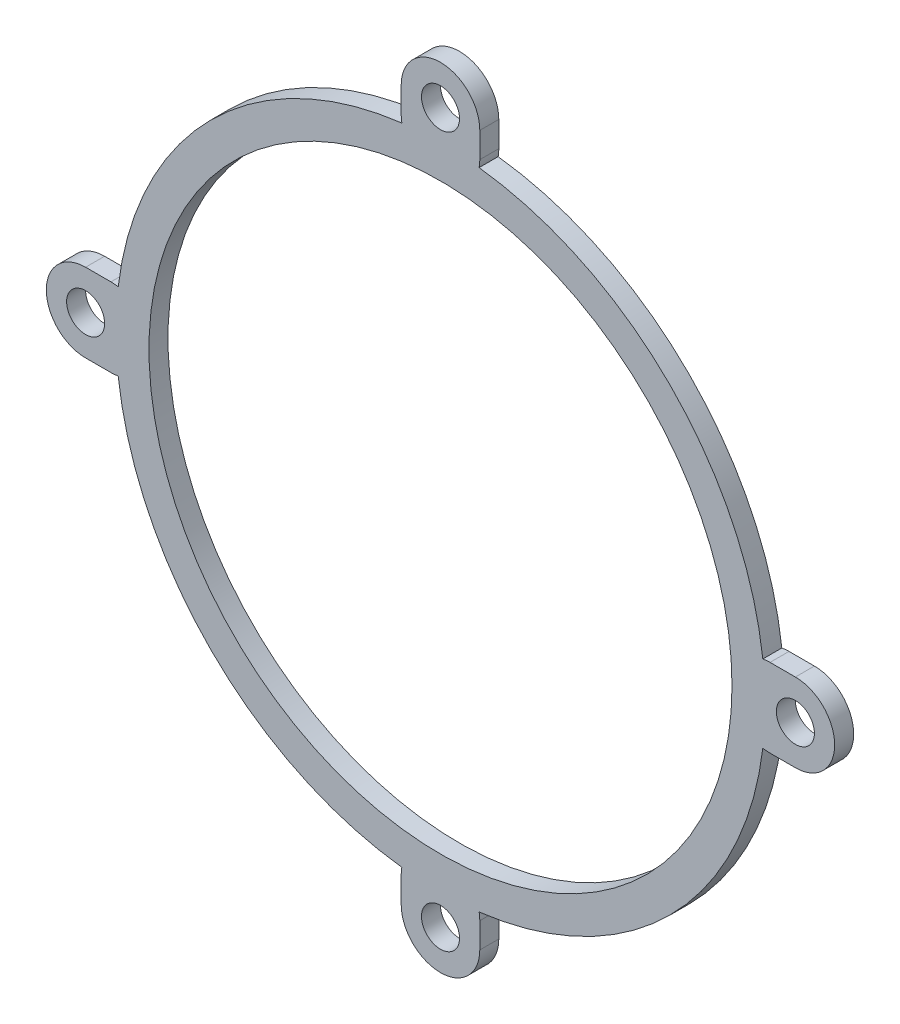
ISO-10303-21;
HEADER;
FILE_DESCRIPTION(('STEP AP214'),'2;1');
FILE_NAME('part.step','',(''),(''),'','','');
FILE_SCHEMA(('AUTOMOTIVE_DESIGN { 1 0 10303 214 1 1 1 1 }'));
ENDSEC;
DATA;
#1=APPLICATION_CONTEXT('core data for automotive mechanical design processes');
#2=APPLICATION_PROTOCOL_DEFINITION('international standard','automotive_design',2000,#1);
#3=PRODUCT_CONTEXT('',#1,'mechanical');
#4=PRODUCT('Part','Part','',(#3));
#5=PRODUCT_RELATED_PRODUCT_CATEGORY('part','',(#4));
#6=PRODUCT_DEFINITION_FORMATION('','',#4);
#7=PRODUCT_DEFINITION_CONTEXT('part definition',#1,'design');
#8=PRODUCT_DEFINITION('design','',#6,#7);
#9=PRODUCT_DEFINITION_SHAPE('','',#8);
#10=(LENGTH_UNIT() NAMED_UNIT(*) SI_UNIT(.MILLI.,.METRE.));
#11=(NAMED_UNIT(*) PLANE_ANGLE_UNIT() SI_UNIT($,.RADIAN.));
#12=(NAMED_UNIT(*) SI_UNIT($,.STERADIAN.) SOLID_ANGLE_UNIT());
#13=UNCERTAINTY_MEASURE_WITH_UNIT(LENGTH_MEASURE(1.E-05),#10,'distance_accuracy_value','');
#14=(GEOMETRIC_REPRESENTATION_CONTEXT(3) GLOBAL_UNCERTAINTY_ASSIGNED_CONTEXT((#13)) GLOBAL_UNIT_ASSIGNED_CONTEXT((#10,
#11,#12)) REPRESENTATION_CONTEXT('',''));
#15=CARTESIAN_POINT('',(0.,0.,0.));
#16=DIRECTION('',(0.,0.,1.));
#17=DIRECTION('',(1.,0.,0.));
#18=AXIS2_PLACEMENT_3D('',#15,#16,#17);
#19=CARTESIAN_POINT('',(0.,-26.,1.5));
#20=DIRECTION('',(0.,0.,1.));
#21=DIRECTION('',(1.,0.,0.));
#22=AXIS2_PLACEMENT_3D('',#19,#20,#21);
#23=PLANE('',#22);
#24=CARTESIAN_POINT('',(28.,0.,1.5));
#25=DIRECTION('',(0.,0.,1.));
#26=DIRECTION('',(1.,0.,0.));
#27=AXIS2_PLACEMENT_3D('',#24,#25,#26);
#28=CIRCLE('',#27,1.5);
#29=CARTESIAN_POINT('',(29.5,0.,1.5));
#30=VERTEX_POINT('',#29);
#31=EDGE_CURVE('E528',#30,#30,#28,.T.);
#32=ORIENTED_EDGE('',*,*,#31,.F.);
#33=EDGE_LOOP('',(#32));
#34=FACE_BOUND('',#33,.T.);
#35=CARTESIAN_POINT('',(-28.,0.,1.5));
#36=DIRECTION('',(0.,0.,1.));
#37=DIRECTION('',(1.,0.,0.));
#38=AXIS2_PLACEMENT_3D('',#35,#36,#37);
#39=CIRCLE('',#38,1.5);
#40=CARTESIAN_POINT('',(-26.5,0.,1.5));
#41=VERTEX_POINT('',#40);
#42=EDGE_CURVE('E544',#41,#41,#39,.T.);
#43=ORIENTED_EDGE('',*,*,#42,.F.);
#44=EDGE_LOOP('',(#43));
#45=FACE_BOUND('',#44,.T.);
#46=CARTESIAN_POINT('',(0.,-26.,1.5));
#47=DIRECTION('',(0.,0.,1.));
#48=DIRECTION('',(1.,0.,0.));
#49=AXIS2_PLACEMENT_3D('',#46,#47,#48);
#50=CIRCLE('',#49,3.1);
#51=CARTESIAN_POINT('',(3.1,-26.,1.5));
#52=VERTEX_POINT('',#51);
#53=CARTESIAN_POINT('',(3.04696472646622,-25.4290306876279,1.5));
#54=VERTEX_POINT('',#53);
#55=EDGE_CURVE('E308',#52,#54,#50,.T.);
#56=ORIENTED_EDGE('',*,*,#55,.T.);
#57=CARTESIAN_POINT('',(0.,0.,1.5));
#58=DIRECTION('',(0.,0.,1.));
#59=DIRECTION('',(1.,0.,0.));
#60=AXIS2_PLACEMENT_3D('',#57,#58,#59);
#61=CIRCLE('',#60,25.6109272724876);
#62=CARTESIAN_POINT('',(25.4290306876279,-3.04696472646621,1.5));
#63=VERTEX_POINT('',#62);
#64=EDGE_CURVE('E148',#54,#63,#61,.T.);
#65=ORIENTED_EDGE('',*,*,#64,.T.);
#66=CARTESIAN_POINT('',(26.,0.,1.5));
#67=DIRECTION('',(0.,0.,1.));
#68=DIRECTION('',(1.,0.,0.));
#69=AXIS2_PLACEMENT_3D('',#66,#67,#68);
#70=CIRCLE('',#69,3.1);
#71=CARTESIAN_POINT('',(26.,-3.1,1.5));
#72=VERTEX_POINT('',#71);
#73=EDGE_CURVE('E393',#63,#72,#70,.T.);
#74=ORIENTED_EDGE('',*,*,#73,.T.);
#75=DIRECTION('',(1.,0.,0.));
#76=VECTOR('',#75,1.);
#77=CARTESIAN_POINT('',(26.,-3.1,1.5));
#78=LINE('',#77,#76);
#79=CARTESIAN_POINT('',(28.,-3.1,1.5));
#80=VERTEX_POINT('',#79);
#81=EDGE_CURVE('E413',#72,#80,#78,.T.);
#82=ORIENTED_EDGE('',*,*,#81,.T.);
#83=CARTESIAN_POINT('',(28.,0.,1.5));
#84=DIRECTION('',(0.,0.,1.));
#85=DIRECTION('',(1.,0.,0.));
#86=AXIS2_PLACEMENT_3D('',#83,#84,#85);
#87=CIRCLE('',#86,3.1);
#88=CARTESIAN_POINT('',(28.,3.1,1.5));
#89=VERTEX_POINT('',#88);
#90=EDGE_CURVE('E409',#80,#89,#87,.T.);
#91=ORIENTED_EDGE('',*,*,#90,.T.);
#92=DIRECTION('',(-1.,0.,0.));
#93=VECTOR('',#92,1.);
#94=CARTESIAN_POINT('',(28.,3.1,1.5));
#95=LINE('',#94,#93);
#96=CARTESIAN_POINT('',(26.,3.1,1.5));
#97=VERTEX_POINT('',#96);
#98=EDGE_CURVE('E412',#89,#97,#95,.T.);
#99=ORIENTED_EDGE('',*,*,#98,.T.);
#100=CARTESIAN_POINT('',(26.,0.,1.5));
#101=DIRECTION('',(0.,0.,1.));
#102=DIRECTION('',(1.,0.,0.));
#103=AXIS2_PLACEMENT_3D('',#100,#101,#102);
#104=CIRCLE('',#103,3.1);
#105=CARTESIAN_POINT('',(25.4290306876279,3.04696472646622,1.5));
#106=VERTEX_POINT('',#105);
#107=EDGE_CURVE('E417',#97,#106,#104,.T.);
#108=ORIENTED_EDGE('',*,*,#107,.T.);
#109=CARTESIAN_POINT('',(0.,0.,1.5));
#110=DIRECTION('',(0.,0.,1.));
#111=DIRECTION('',(1.,0.,0.));
#112=AXIS2_PLACEMENT_3D('',#109,#110,#111);
#113=CIRCLE('',#112,25.6109272724876);
#114=CARTESIAN_POINT('',(3.04696472646621,25.4290306876279,1.5));
#115=VERTEX_POINT('',#114);
#116=EDGE_CURVE('E424',#106,#115,#113,.T.);
#117=ORIENTED_EDGE('',*,*,#116,.T.);
#118=CARTESIAN_POINT('',(0.,26.,1.5));
#119=DIRECTION('',(0.,0.,1.));
#120=DIRECTION('',(1.,0.,0.));
#121=AXIS2_PLACEMENT_3D('',#118,#119,#120);
#122=CIRCLE('',#121,3.1);
#123=CARTESIAN_POINT('',(3.09999999999999,26.,1.5));
#124=VERTEX_POINT('',#123);
#125=EDGE_CURVE('E427',#115,#124,#122,.T.);
#126=ORIENTED_EDGE('',*,*,#125,.T.);
#127=DIRECTION('',(0.,1.,0.));
#128=VECTOR('',#127,1.);
#129=CARTESIAN_POINT('',(3.09999999999999,26.,1.5));
#130=LINE('',#129,#128);
#131=CARTESIAN_POINT('',(3.09999999999999,28.,1.5));
#132=VERTEX_POINT('',#131);
#133=EDGE_CURVE('E430',#124,#132,#130,.T.);
#134=ORIENTED_EDGE('',*,*,#133,.T.);
#135=CARTESIAN_POINT('',(0.,28.,1.5));
#136=DIRECTION('',(0.,0.,1.));
#137=DIRECTION('',(1.,0.,0.));
#138=AXIS2_PLACEMENT_3D('',#135,#136,#137);
#139=CIRCLE('',#138,3.1);
#140=CARTESIAN_POINT('',(-3.10000000000001,28.,1.5));
#141=VERTEX_POINT('',#140);
#142=EDGE_CURVE('E433',#132,#141,#139,.T.);
#143=ORIENTED_EDGE('',*,*,#142,.T.);
#144=DIRECTION('',(0.,-1.,0.));
#145=VECTOR('',#144,1.);
#146=CARTESIAN_POINT('',(-3.10000000000002,28.,1.5));
#147=LINE('',#146,#145);
#148=CARTESIAN_POINT('',(-3.10000000000002,26.,1.5));
#149=VERTEX_POINT('',#148);
#150=EDGE_CURVE('E436',#141,#149,#147,.T.);
#151=ORIENTED_EDGE('',*,*,#150,.T.);
#152=CARTESIAN_POINT('',(0.,26.,1.5));
#153=DIRECTION('',(0.,0.,1.));
#154=DIRECTION('',(1.,0.,0.));
#155=AXIS2_PLACEMENT_3D('',#152,#153,#154);
#156=CIRCLE('',#155,3.1);
#157=CARTESIAN_POINT('',(-3.04696472646623,25.4290306876279,1.5));
#158=VERTEX_POINT('',#157);
#159=EDGE_CURVE('E439',#149,#158,#156,.T.);
#160=ORIENTED_EDGE('',*,*,#159,.T.);
#161=CARTESIAN_POINT('',(0.,0.,1.5));
#162=DIRECTION('',(0.,0.,1.));
#163=DIRECTION('',(1.,0.,0.));
#164=AXIS2_PLACEMENT_3D('',#161,#162,#163);
#165=CIRCLE('',#164,25.6109272724876);
#166=CARTESIAN_POINT('',(-25.4290306876279,3.04696472646622,1.5));
#167=VERTEX_POINT('',#166);
#168=EDGE_CURVE('E442',#158,#167,#165,.T.);
#169=ORIENTED_EDGE('',*,*,#168,.T.);
#170=CARTESIAN_POINT('',(-26.,0.,1.5));
#171=DIRECTION('',(0.,0.,1.));
#172=DIRECTION('',(1.,0.,0.));
#173=AXIS2_PLACEMENT_3D('',#170,#171,#172);
#174=CIRCLE('',#173,3.1);
#175=CARTESIAN_POINT('',(-26.,3.1,1.5));
#176=VERTEX_POINT('',#175);
#177=EDGE_CURVE('E445',#167,#176,#174,.T.);
#178=ORIENTED_EDGE('',*,*,#177,.T.);
#179=DIRECTION('',(-1.,0.,0.));
#180=VECTOR('',#179,1.);
#181=CARTESIAN_POINT('',(-26.,3.1,1.5));
#182=LINE('',#181,#180);
#183=CARTESIAN_POINT('',(-28.,3.1,1.5));
#184=VERTEX_POINT('',#183);
#185=EDGE_CURVE('E448',#176,#184,#182,.T.);
#186=ORIENTED_EDGE('',*,*,#185,.T.);
#187=CARTESIAN_POINT('',(-28.,0.,1.5));
#188=DIRECTION('',(0.,0.,1.));
#189=DIRECTION('',(1.,0.,0.));
#190=AXIS2_PLACEMENT_3D('',#187,#188,#189);
#191=CIRCLE('',#190,3.1);
#192=CARTESIAN_POINT('',(-28.,-3.1,1.5));
#193=VERTEX_POINT('',#192);
#194=EDGE_CURVE('E451',#184,#193,#191,.T.);
#195=ORIENTED_EDGE('',*,*,#194,.T.);
#196=DIRECTION('',(1.,0.,0.));
#197=VECTOR('',#196,1.);
#198=CARTESIAN_POINT('',(-28.,-3.1,1.5));
#199=LINE('',#198,#197);
#200=CARTESIAN_POINT('',(-26.,-3.1,1.5));
#201=VERTEX_POINT('',#200);
#202=EDGE_CURVE('E454',#193,#201,#199,.T.);
#203=ORIENTED_EDGE('',*,*,#202,.T.);
#204=CARTESIAN_POINT('',(-26.,0.,1.5));
#205=DIRECTION('',(0.,0.,1.));
#206=DIRECTION('',(1.,0.,0.));
#207=AXIS2_PLACEMENT_3D('',#204,#205,#206);
#208=CIRCLE('',#207,3.1);
#209=CARTESIAN_POINT('',(-25.4290306876279,-3.04696472646621,1.5));
#210=VERTEX_POINT('',#209);
#211=EDGE_CURVE('E457',#201,#210,#208,.T.);
#212=ORIENTED_EDGE('',*,*,#211,.T.);
#213=CARTESIAN_POINT('',(0.,0.,1.5));
#214=DIRECTION('',(0.,0.,1.));
#215=DIRECTION('',(1.,0.,0.));
#216=AXIS2_PLACEMENT_3D('',#213,#214,#215);
#217=CIRCLE('',#216,25.6109272724876);
#218=CARTESIAN_POINT('',(-3.04696472646621,-25.4290306876279,1.5));
#219=VERTEX_POINT('',#218);
#220=EDGE_CURVE('E460',#210,#219,#217,.T.);
#221=ORIENTED_EDGE('',*,*,#220,.T.);
#222=CARTESIAN_POINT('',(0.,-26.,1.5));
#223=DIRECTION('',(0.,0.,1.));
#224=DIRECTION('',(1.,0.,0.));
#225=AXIS2_PLACEMENT_3D('',#222,#223,#224);
#226=CIRCLE('',#225,3.1);
#227=CARTESIAN_POINT('',(-3.1,-26.,1.5));
#228=VERTEX_POINT('',#227);
#229=EDGE_CURVE('E215',#219,#228,#226,.T.);
#230=ORIENTED_EDGE('',*,*,#229,.T.);
#231=DIRECTION('',(0.,-1.,0.));
#232=VECTOR('',#231,1.);
#233=CARTESIAN_POINT('',(-3.1,-26.,1.5));
#234=LINE('',#233,#232);
#235=CARTESIAN_POINT('',(-3.1,-28.,1.5));
#236=VERTEX_POINT('',#235);
#237=EDGE_CURVE('E209',#228,#236,#234,.T.);
#238=ORIENTED_EDGE('',*,*,#237,.T.);
#239=CARTESIAN_POINT('',(0.,-28.,1.5));
#240=DIRECTION('',(0.,0.,1.));
#241=DIRECTION('',(1.,0.,0.));
#242=AXIS2_PLACEMENT_3D('',#239,#240,#241);
#243=CIRCLE('',#242,3.1);
#244=CARTESIAN_POINT('',(3.1,-28.,1.5));
#245=VERTEX_POINT('',#244);
#246=EDGE_CURVE('E213',#236,#245,#243,.T.);
#247=ORIENTED_EDGE('',*,*,#246,.T.);
#248=DIRECTION('',(0.,1.,0.));
#249=VECTOR('',#248,1.);
#250=CARTESIAN_POINT('',(3.1,-28.,1.5));
#251=LINE('',#250,#249);
#252=EDGE_CURVE('E57',#245,#52,#251,.T.);
#253=ORIENTED_EDGE('',*,*,#252,.T.);
#254=EDGE_LOOP('',(#56,#65,#74,#82,#91,#99,#108,#117,#126,#134,#143,#151,#160,#169,#178,#186,
#195,#203,#212,#221,#230,#238,#247,#253));
#255=FACE_BOUND('',#254,.T.);
#256=CARTESIAN_POINT('',(0.,0.,1.5));
#257=DIRECTION('',(0.,0.,1.));
#258=DIRECTION('',(1.,0.,0.));
#259=AXIS2_PLACEMENT_3D('',#256,#257,#258);
#260=CIRCLE('',#259,23.);
#261=CARTESIAN_POINT('',(23.,0.,1.5));
#262=VERTEX_POINT('',#261);
#263=EDGE_CURVE('E242',#262,#262,#260,.T.);
#264=ORIENTED_EDGE('',*,*,#263,.F.);
#265=EDGE_LOOP('',(#264));
#266=FACE_BOUND('',#265,.T.);
#267=CARTESIAN_POINT('',(0.,28.,1.5));
#268=DIRECTION('',(0.,0.,1.));
#269=DIRECTION('',(1.,0.,0.));
#270=AXIS2_PLACEMENT_3D('',#267,#268,#269);
#271=CIRCLE('',#270,1.5);
#272=CARTESIAN_POINT('',(1.49999999999999,28.,1.5));
#273=VERTEX_POINT('',#272);
#274=EDGE_CURVE('E536',#273,#273,#271,.T.);
#275=ORIENTED_EDGE('',*,*,#274,.F.);
#276=EDGE_LOOP('',(#275));
#277=FACE_BOUND('',#276,.T.);
#278=CARTESIAN_POINT('',(0.,-28.,1.5));
#279=DIRECTION('',(0.,0.,1.));
#280=DIRECTION('',(1.,0.,0.));
#281=AXIS2_PLACEMENT_3D('',#278,#279,#280);
#282=CIRCLE('',#281,1.5);
#283=CARTESIAN_POINT('',(1.5,-28.,1.5));
#284=VERTEX_POINT('',#283);
#285=EDGE_CURVE('E517',#284,#284,#282,.T.);
#286=ORIENTED_EDGE('',*,*,#285,.F.);
#287=EDGE_LOOP('',(#286));
#288=FACE_BOUND('',#287,.T.);
#289=ADVANCED_FACE('F39',(#34,#45,#255,#266,#277,#288),#23,.T.);
#290=CARTESIAN_POINT('',(0.,-26.,0.));
#291=DIRECTION('',(0.,0.,1.));
#292=DIRECTION('',(1.,0.,0.));
#293=AXIS2_PLACEMENT_3D('',#290,#291,#292);
#294=PLANE('',#293);
#295=CARTESIAN_POINT('',(0.,-26.,0.));
#296=DIRECTION('',(0.,0.,1.));
#297=DIRECTION('',(1.,0.,0.));
#298=AXIS2_PLACEMENT_3D('',#295,#296,#297);
#299=CIRCLE('',#298,3.1);
#300=CARTESIAN_POINT('',(3.1,-26.,0.));
#301=VERTEX_POINT('',#300);
#302=CARTESIAN_POINT('',(3.04696472646622,-25.4290306876279,0.));
#303=VERTEX_POINT('',#302);
#304=EDGE_CURVE('E237',#301,#303,#299,.T.);
#305=ORIENTED_EDGE('',*,*,#304,.F.);
#306=DIRECTION('',(0.,1.,0.));
#307=VECTOR('',#306,1.);
#308=CARTESIAN_POINT('',(3.1,-28.,0.));
#309=LINE('',#308,#307);
#310=CARTESIAN_POINT('',(3.1,-28.,0.));
#311=VERTEX_POINT('',#310);
#312=EDGE_CURVE('E140',#311,#301,#309,.T.);
#313=ORIENTED_EDGE('',*,*,#312,.F.);
#314=CARTESIAN_POINT('',(0.,-28.,0.));
#315=DIRECTION('',(0.,0.,1.));
#316=DIRECTION('',(1.,0.,0.));
#317=AXIS2_PLACEMENT_3D('',#314,#315,#316);
#318=CIRCLE('',#317,3.1);
#319=CARTESIAN_POINT('',(-3.1,-28.,0.));
#320=VERTEX_POINT('',#319);
#321=EDGE_CURVE('E134',#320,#311,#318,.T.);
#322=ORIENTED_EDGE('',*,*,#321,.F.);
#323=DIRECTION('',(0.,-1.,0.));
#324=VECTOR('',#323,1.);
#325=CARTESIAN_POINT('',(-3.1,-26.,0.));
#326=LINE('',#325,#324);
#327=CARTESIAN_POINT('',(-3.1,-26.,0.));
#328=VERTEX_POINT('',#327);
#329=EDGE_CURVE('E224',#328,#320,#326,.T.);
#330=ORIENTED_EDGE('',*,*,#329,.F.);
#331=CARTESIAN_POINT('',(0.,-26.,0.));
#332=DIRECTION('',(0.,0.,1.));
#333=DIRECTION('',(1.,0.,0.));
#334=AXIS2_PLACEMENT_3D('',#331,#332,#333);
#335=CIRCLE('',#334,3.1);
#336=CARTESIAN_POINT('',(-3.04696472646621,-25.4290306876279,0.));
#337=VERTEX_POINT('',#336);
#338=EDGE_CURVE('E299',#337,#328,#335,.T.);
#339=ORIENTED_EDGE('',*,*,#338,.F.);
#340=CARTESIAN_POINT('',(0.,0.,0.));
#341=DIRECTION('',(0.,0.,1.));
#342=DIRECTION('',(1.,0.,0.));
#343=AXIS2_PLACEMENT_3D('',#340,#341,#342);
#344=CIRCLE('',#343,25.6109272724876);
#345=CARTESIAN_POINT('',(-25.4290306876279,-3.04696472646621,0.));
#346=VERTEX_POINT('',#345);
#347=EDGE_CURVE('E296',#346,#337,#344,.T.);
#348=ORIENTED_EDGE('',*,*,#347,.F.);
#349=CARTESIAN_POINT('',(-26.,0.,0.));
#350=DIRECTION('',(0.,0.,1.));
#351=DIRECTION('',(1.,0.,0.));
#352=AXIS2_PLACEMENT_3D('',#349,#350,#351);
#353=CIRCLE('',#352,3.1);
#354=CARTESIAN_POINT('',(-26.,-3.1,0.));
#355=VERTEX_POINT('',#354);
#356=EDGE_CURVE('E293',#355,#346,#353,.T.);
#357=ORIENTED_EDGE('',*,*,#356,.F.);
#358=DIRECTION('',(1.,0.,0.));
#359=VECTOR('',#358,1.);
#360=CARTESIAN_POINT('',(-28.,-3.1,0.));
#361=LINE('',#360,#359);
#362=CARTESIAN_POINT('',(-28.,-3.1,0.));
#363=VERTEX_POINT('',#362);
#364=EDGE_CURVE('E290',#363,#355,#361,.T.);
#365=ORIENTED_EDGE('',*,*,#364,.F.);
#366=CARTESIAN_POINT('',(-28.,0.,0.));
#367=DIRECTION('',(0.,0.,1.));
#368=DIRECTION('',(1.,0.,0.));
#369=AXIS2_PLACEMENT_3D('',#366,#367,#368);
#370=CIRCLE('',#369,3.1);
#371=CARTESIAN_POINT('',(-28.,3.1,0.));
#372=VERTEX_POINT('',#371);
#373=EDGE_CURVE('E287',#372,#363,#370,.T.);
#374=ORIENTED_EDGE('',*,*,#373,.F.);
#375=DIRECTION('',(-1.,0.,0.));
#376=VECTOR('',#375,1.);
#377=CARTESIAN_POINT('',(-26.,3.1,0.));
#378=LINE('',#377,#376);
#379=CARTESIAN_POINT('',(-26.,3.1,0.));
#380=VERTEX_POINT('',#379);
#381=EDGE_CURVE('E284',#380,#372,#378,.T.);
#382=ORIENTED_EDGE('',*,*,#381,.F.);
#383=CARTESIAN_POINT('',(-26.,0.,0.));
#384=DIRECTION('',(0.,0.,1.));
#385=DIRECTION('',(1.,0.,0.));
#386=AXIS2_PLACEMENT_3D('',#383,#384,#385);
#387=CIRCLE('',#386,3.1);
#388=CARTESIAN_POINT('',(-25.4290306876279,3.04696472646622,0.));
#389=VERTEX_POINT('',#388);
#390=EDGE_CURVE('E281',#389,#380,#387,.T.);
#391=ORIENTED_EDGE('',*,*,#390,.F.);
#392=CARTESIAN_POINT('',(0.,0.,0.));
#393=DIRECTION('',(0.,0.,1.));
#394=DIRECTION('',(1.,0.,0.));
#395=AXIS2_PLACEMENT_3D('',#392,#393,#394);
#396=CIRCLE('',#395,25.6109272724876);
#397=CARTESIAN_POINT('',(-3.04696472646623,25.4290306876279,0.));
#398=VERTEX_POINT('',#397);
#399=EDGE_CURVE('E278',#398,#389,#396,.T.);
#400=ORIENTED_EDGE('',*,*,#399,.F.);
#401=CARTESIAN_POINT('',(0.,26.,0.));
#402=DIRECTION('',(0.,0.,1.));
#403=DIRECTION('',(1.,0.,0.));
#404=AXIS2_PLACEMENT_3D('',#401,#402,#403);
#405=CIRCLE('',#404,3.1);
#406=CARTESIAN_POINT('',(-3.10000000000002,26.,0.));
#407=VERTEX_POINT('',#406);
#408=EDGE_CURVE('E275',#407,#398,#405,.T.);
#409=ORIENTED_EDGE('',*,*,#408,.F.);
#410=DIRECTION('',(0.,-1.,0.));
#411=VECTOR('',#410,1.);
#412=CARTESIAN_POINT('',(-3.10000000000002,28.,0.));
#413=LINE('',#412,#411);
#414=CARTESIAN_POINT('',(-3.10000000000001,28.,0.));
#415=VERTEX_POINT('',#414);
#416=EDGE_CURVE('E272',#415,#407,#413,.T.);
#417=ORIENTED_EDGE('',*,*,#416,.F.);
#418=CARTESIAN_POINT('',(0.,28.,0.));
#419=DIRECTION('',(0.,0.,1.));
#420=DIRECTION('',(1.,0.,0.));
#421=AXIS2_PLACEMENT_3D('',#418,#419,#420);
#422=CIRCLE('',#421,3.1);
#423=CARTESIAN_POINT('',(3.09999999999999,28.,0.));
#424=VERTEX_POINT('',#423);
#425=EDGE_CURVE('E269',#424,#415,#422,.T.);
#426=ORIENTED_EDGE('',*,*,#425,.F.);
#427=DIRECTION('',(0.,1.,0.));
#428=VECTOR('',#427,1.);
#429=CARTESIAN_POINT('',(3.09999999999999,26.,0.));
#430=LINE('',#429,#428);
#431=CARTESIAN_POINT('',(3.09999999999999,26.,0.));
#432=VERTEX_POINT('',#431);
#433=EDGE_CURVE('E266',#432,#424,#430,.T.);
#434=ORIENTED_EDGE('',*,*,#433,.F.);
#435=CARTESIAN_POINT('',(0.,26.,0.));
#436=DIRECTION('',(0.,0.,1.));
#437=DIRECTION('',(1.,0.,0.));
#438=AXIS2_PLACEMENT_3D('',#435,#436,#437);
#439=CIRCLE('',#438,3.1);
#440=CARTESIAN_POINT('',(3.04696472646621,25.4290306876279,0.));
#441=VERTEX_POINT('',#440);
#442=EDGE_CURVE('E263',#441,#432,#439,.T.);
#443=ORIENTED_EDGE('',*,*,#442,.F.);
#444=CARTESIAN_POINT('',(0.,0.,0.));
#445=DIRECTION('',(0.,0.,1.));
#446=DIRECTION('',(1.,0.,0.));
#447=AXIS2_PLACEMENT_3D('',#444,#445,#446);
#448=CIRCLE('',#447,25.6109272724876);
#449=CARTESIAN_POINT('',(25.4290306876279,3.04696472646622,0.));
#450=VERTEX_POINT('',#449);
#451=EDGE_CURVE('E260',#450,#441,#448,.T.);
#452=ORIENTED_EDGE('',*,*,#451,.F.);
#453=CARTESIAN_POINT('',(26.,0.,0.));
#454=DIRECTION('',(0.,0.,1.));
#455=DIRECTION('',(1.,0.,0.));
#456=AXIS2_PLACEMENT_3D('',#453,#454,#455);
#457=CIRCLE('',#456,3.1);
#458=CARTESIAN_POINT('',(26.,3.1,0.));
#459=VERTEX_POINT('',#458);
#460=EDGE_CURVE('E257',#459,#450,#457,.T.);
#461=ORIENTED_EDGE('',*,*,#460,.F.);
#462=DIRECTION('',(-1.,0.,0.));
#463=VECTOR('',#462,1.);
#464=CARTESIAN_POINT('',(28.,3.1,0.));
#465=LINE('',#464,#463);
#466=CARTESIAN_POINT('',(28.,3.1,0.));
#467=VERTEX_POINT('',#466);
#468=EDGE_CURVE('E254',#467,#459,#465,.T.);
#469=ORIENTED_EDGE('',*,*,#468,.F.);
#470=CARTESIAN_POINT('',(28.,0.,0.));
#471=DIRECTION('',(0.,0.,1.));
#472=DIRECTION('',(1.,0.,0.));
#473=AXIS2_PLACEMENT_3D('',#470,#471,#472);
#474=CIRCLE('',#473,3.1);
#475=CARTESIAN_POINT('',(28.,-3.1,0.));
#476=VERTEX_POINT('',#475);
#477=EDGE_CURVE('E251',#476,#467,#474,.T.);
#478=ORIENTED_EDGE('',*,*,#477,.F.);
#479=DIRECTION('',(1.,0.,0.));
#480=VECTOR('',#479,1.);
#481=CARTESIAN_POINT('',(26.,-3.1,0.));
#482=LINE('',#481,#480);
#483=CARTESIAN_POINT('',(26.,-3.1,0.));
#484=VERTEX_POINT('',#483);
#485=EDGE_CURVE('E248',#484,#476,#482,.T.);
#486=ORIENTED_EDGE('',*,*,#485,.F.);
#487=CARTESIAN_POINT('',(26.,0.,0.));
#488=DIRECTION('',(0.,0.,1.));
#489=DIRECTION('',(1.,0.,0.));
#490=AXIS2_PLACEMENT_3D('',#487,#488,#489);
#491=CIRCLE('',#490,3.1);
#492=CARTESIAN_POINT('',(25.4290306876279,-3.04696472646621,0.));
#493=VERTEX_POINT('',#492);
#494=EDGE_CURVE('E245',#493,#484,#491,.T.);
#495=ORIENTED_EDGE('',*,*,#494,.F.);
#496=CARTESIAN_POINT('',(0.,0.,0.));
#497=DIRECTION('',(0.,0.,1.));
#498=DIRECTION('',(1.,0.,0.));
#499=AXIS2_PLACEMENT_3D('',#496,#497,#498);
#500=CIRCLE('',#499,25.6109272724876);
#501=EDGE_CURVE('E241',#303,#493,#500,.T.);
#502=ORIENTED_EDGE('',*,*,#501,.F.);
#503=EDGE_LOOP('',(#305,#313,#322,#330,#339,#348,#357,#365,#374,#382,#391,#400,#409,#417,#426,
#434,#443,#452,#461,#469,#478,#486,#495,#502));
#504=FACE_BOUND('',#503,.T.);
#505=CARTESIAN_POINT('',(0.,0.,0.));
#506=DIRECTION('',(0.,0.,1.));
#507=DIRECTION('',(1.,0.,0.));
#508=AXIS2_PLACEMENT_3D('',#505,#506,#507);
#509=CIRCLE('',#508,23.);
#510=CARTESIAN_POINT('',(23.,0.,0.));
#511=VERTEX_POINT('',#510);
#512=EDGE_CURVE('E548',#511,#511,#509,.T.);
#513=ORIENTED_EDGE('',*,*,#512,.T.);
#514=EDGE_LOOP('',(#513));
#515=FACE_BOUND('',#514,.T.);
#516=CARTESIAN_POINT('',(-28.,0.,0.));
#517=DIRECTION('',(0.,0.,1.));
#518=DIRECTION('',(1.,0.,0.));
#519=AXIS2_PLACEMENT_3D('',#516,#517,#518);
#520=CIRCLE('',#519,1.5);
#521=CARTESIAN_POINT('',(-26.5,0.,0.));
#522=VERTEX_POINT('',#521);
#523=EDGE_CURVE('E540',#522,#522,#520,.T.);
#524=ORIENTED_EDGE('',*,*,#523,.T.);
#525=EDGE_LOOP('',(#524));
#526=FACE_BOUND('',#525,.T.);
#527=CARTESIAN_POINT('',(0.,28.,0.));
#528=DIRECTION('',(0.,0.,1.));
#529=DIRECTION('',(1.,0.,0.));
#530=AXIS2_PLACEMENT_3D('',#527,#528,#529);
#531=CIRCLE('',#530,1.5);
#532=CARTESIAN_POINT('',(1.49999999999999,28.,0.));
#533=VERTEX_POINT('',#532);
#534=EDGE_CURVE('E532',#533,#533,#531,.T.);
#535=ORIENTED_EDGE('',*,*,#534,.T.);
#536=EDGE_LOOP('',(#535));
#537=FACE_BOUND('',#536,.T.);
#538=CARTESIAN_POINT('',(28.,0.,0.));
#539=DIRECTION('',(0.,0.,1.));
#540=DIRECTION('',(1.,0.,0.));
#541=AXIS2_PLACEMENT_3D('',#538,#539,#540);
#542=CIRCLE('',#541,1.5);
#543=CARTESIAN_POINT('',(29.5,0.,0.));
#544=VERTEX_POINT('',#543);
#545=EDGE_CURVE('E525',#544,#544,#542,.T.);
#546=ORIENTED_EDGE('',*,*,#545,.T.);
#547=EDGE_LOOP('',(#546));
#548=FACE_BOUND('',#547,.T.);
#549=CARTESIAN_POINT('',(0.,-28.,0.));
#550=DIRECTION('',(0.,0.,1.));
#551=DIRECTION('',(1.,0.,0.));
#552=AXIS2_PLACEMENT_3D('',#549,#550,#551);
#553=CIRCLE('',#552,1.5);
#554=CARTESIAN_POINT('',(1.5,-28.,0.));
#555=VERTEX_POINT('',#554);
#556=EDGE_CURVE('E520',#555,#555,#553,.T.);
#557=ORIENTED_EDGE('',*,*,#556,.T.);
#558=EDGE_LOOP('',(#557));
#559=FACE_BOUND('',#558,.T.);
#560=ADVANCED_FACE('F397',(#504,#515,#526,#537,#548,#559),#294,.F.);
#561=CARTESIAN_POINT('',(0.,-26.,1.5));
#562=DIRECTION('',(0.,0.,-1.));
#563=DIRECTION('',(-1.,0.,0.));
#564=AXIS2_PLACEMENT_3D('',#561,#562,#563);
#565=CYLINDRICAL_SURFACE('',#564,3.1);
#566=ORIENTED_EDGE('',*,*,#304,.T.);
#567=DIRECTION('',(0.,0.,-1.));
#568=VECTOR('',#567,1.);
#569=CARTESIAN_POINT('',(3.04696472646622,-25.4290306876279,1.5));
#570=LINE('',#569,#568);
#571=EDGE_CURVE('E11',#54,#303,#570,.T.);
#572=ORIENTED_EDGE('',*,*,#571,.F.);
#573=ORIENTED_EDGE('',*,*,#55,.F.);
#574=DIRECTION('',(0.,0.,-1.));
#575=VECTOR('',#574,1.);
#576=CARTESIAN_POINT('',(3.1,-26.,1.5));
#577=LINE('',#576,#575);
#578=EDGE_CURVE('E233',#52,#301,#577,.T.);
#579=ORIENTED_EDGE('',*,*,#578,.T.);
#580=EDGE_LOOP('',(#566,#572,#573,#579));
#581=FACE_BOUND('',#580,.T.);
#582=ADVANCED_FACE('F41',(#581),#565,.T.);
#583=CARTESIAN_POINT('',(0.,0.,1.5));
#584=DIRECTION('',(0.,0.,-1.));
#585=DIRECTION('',(-1.,0.,0.));
#586=AXIS2_PLACEMENT_3D('',#583,#584,#585);
#587=CYLINDRICAL_SURFACE('',#586,25.6109272724876);
#588=ORIENTED_EDGE('',*,*,#501,.T.);
#589=DIRECTION('',(0.,0.,-1.));
#590=VECTOR('',#589,1.);
#591=CARTESIAN_POINT('',(25.4290306876279,-3.04696472646621,1.5));
#592=LINE('',#591,#590);
#593=EDGE_CURVE('E49',#63,#493,#592,.T.);
#594=ORIENTED_EDGE('',*,*,#593,.F.);
#595=ORIENTED_EDGE('',*,*,#64,.F.);
#596=ORIENTED_EDGE('',*,*,#571,.T.);
#597=EDGE_LOOP('',(#588,#594,#595,#596));
#598=FACE_BOUND('',#597,.T.);
#599=ADVANCED_FACE('F793',(#598),#587,.T.);
#600=CARTESIAN_POINT('',(26.,0.,1.5));
#601=DIRECTION('',(0.,0.,-1.));
#602=DIRECTION('',(-1.,0.,0.));
#603=AXIS2_PLACEMENT_3D('',#600,#601,#602);
#604=CYLINDRICAL_SURFACE('',#603,3.1);
#605=ORIENTED_EDGE('',*,*,#494,.T.);
#606=DIRECTION('',(0.,0.,-1.));
#607=VECTOR('',#606,1.);
#608=CARTESIAN_POINT('',(26.,-3.1,1.5));
#609=LINE('',#608,#607);
#610=EDGE_CURVE('E383',#72,#484,#609,.T.);
#611=ORIENTED_EDGE('',*,*,#610,.F.);
#612=ORIENTED_EDGE('',*,*,#73,.F.);
#613=ORIENTED_EDGE('',*,*,#593,.T.);
#614=EDGE_LOOP('',(#605,#611,#612,#613));
#615=FACE_BOUND('',#614,.T.);
#616=ADVANCED_FACE('F391',(#615),#604,.T.);
#617=CARTESIAN_POINT('',(26.,-3.1,1.5));
#618=DIRECTION('',(0.,1.,0.));
#619=DIRECTION('',(0.,0.,1.));
#620=AXIS2_PLACEMENT_3D('',#617,#618,#619);
#621=PLANE('',#620);
#622=ORIENTED_EDGE('',*,*,#485,.T.);
#623=DIRECTION('',(0.,0.,-1.));
#624=VECTOR('',#623,1.);
#625=CARTESIAN_POINT('',(28.,-3.1,1.5));
#626=LINE('',#625,#624);
#627=EDGE_CURVE('E379',#80,#476,#626,.T.);
#628=ORIENTED_EDGE('',*,*,#627,.F.);
#629=ORIENTED_EDGE('',*,*,#81,.F.);
#630=ORIENTED_EDGE('',*,*,#610,.T.);
#631=EDGE_LOOP('',(#622,#628,#629,#630));
#632=FACE_BOUND('',#631,.T.);
#633=ADVANCED_FACE('F403',(#632),#621,.F.);
#634=CARTESIAN_POINT('',(28.,0.,1.5));
#635=DIRECTION('',(0.,0.,-1.));
#636=DIRECTION('',(-1.,0.,0.));
#637=AXIS2_PLACEMENT_3D('',#634,#635,#636);
#638=CYLINDRICAL_SURFACE('',#637,3.1);
#639=ORIENTED_EDGE('',*,*,#477,.T.);
#640=DIRECTION('',(0.,0.,-1.));
#641=VECTOR('',#640,1.);
#642=CARTESIAN_POINT('',(28.,3.1,1.5));
#643=LINE('',#642,#641);
#644=EDGE_CURVE('E375',#89,#467,#643,.T.);
#645=ORIENTED_EDGE('',*,*,#644,.F.);
#646=ORIENTED_EDGE('',*,*,#90,.F.);
#647=ORIENTED_EDGE('',*,*,#627,.T.);
#648=EDGE_LOOP('',(#639,#645,#646,#647));
#649=FACE_BOUND('',#648,.T.);
#650=ADVANCED_FACE('F407',(#649),#638,.T.);
#651=CARTESIAN_POINT('',(28.,3.1,1.5));
#652=DIRECTION('',(0.,-1.,0.));
#653=DIRECTION('',(0.,0.,-1.));
#654=AXIS2_PLACEMENT_3D('',#651,#652,#653);
#655=PLANE('',#654);
#656=ORIENTED_EDGE('',*,*,#468,.T.);
#657=DIRECTION('',(0.,0.,-1.));
#658=VECTOR('',#657,1.);
#659=CARTESIAN_POINT('',(26.,3.1,1.5));
#660=LINE('',#659,#658);
#661=EDGE_CURVE('E371',#97,#459,#660,.T.);
#662=ORIENTED_EDGE('',*,*,#661,.F.);
#663=ORIENTED_EDGE('',*,*,#98,.F.);
#664=ORIENTED_EDGE('',*,*,#644,.T.);
#665=EDGE_LOOP('',(#656,#662,#663,#664));
#666=FACE_BOUND('',#665,.T.);
#667=ADVANCED_FACE('F758',(#666),#655,.F.);
#668=CARTESIAN_POINT('',(26.,0.,1.5));
#669=DIRECTION('',(0.,0.,-1.));
#670=DIRECTION('',(-1.,0.,0.));
#671=AXIS2_PLACEMENT_3D('',#668,#669,#670);
#672=CYLINDRICAL_SURFACE('',#671,3.1);
#673=ORIENTED_EDGE('',*,*,#460,.T.);
#674=DIRECTION('',(0.,0.,-1.));
#675=VECTOR('',#674,1.);
#676=CARTESIAN_POINT('',(25.4290306876279,3.04696472646622,1.5));
#677=LINE('',#676,#675);
#678=EDGE_CURVE('E367',#106,#450,#677,.T.);
#679=ORIENTED_EDGE('',*,*,#678,.F.);
#680=ORIENTED_EDGE('',*,*,#107,.F.);
#681=ORIENTED_EDGE('',*,*,#661,.T.);
#682=EDGE_LOOP('',(#673,#679,#680,#681));
#683=FACE_BOUND('',#682,.T.);
#684=ADVANCED_FACE('F748',(#683),#672,.T.);
#685=CARTESIAN_POINT('',(0.,0.,1.5));
#686=DIRECTION('',(0.,0.,-1.));
#687=DIRECTION('',(-1.,0.,0.));
#688=AXIS2_PLACEMENT_3D('',#685,#686,#687);
#689=CYLINDRICAL_SURFACE('',#688,25.6109272724876);
#690=ORIENTED_EDGE('',*,*,#451,.T.);
#691=DIRECTION('',(0.,0.,-1.));
#692=VECTOR('',#691,1.);
#693=CARTESIAN_POINT('',(3.04696472646621,25.4290306876279,1.5));
#694=LINE('',#693,#692);
#695=EDGE_CURVE('E363',#115,#441,#694,.T.);
#696=ORIENTED_EDGE('',*,*,#695,.F.);
#697=ORIENTED_EDGE('',*,*,#116,.F.);
#698=ORIENTED_EDGE('',*,*,#678,.T.);
#699=EDGE_LOOP('',(#690,#696,#697,#698));
#700=FACE_BOUND('',#699,.T.);
#701=ADVANCED_FACE('F738',(#700),#689,.T.);
#702=CARTESIAN_POINT('',(0.,26.,1.5));
#703=DIRECTION('',(0.,0.,-1.));
#704=DIRECTION('',(-1.,0.,0.));
#705=AXIS2_PLACEMENT_3D('',#702,#703,#704);
#706=CYLINDRICAL_SURFACE('',#705,3.1);
#707=ORIENTED_EDGE('',*,*,#442,.T.);
#708=DIRECTION('',(0.,0.,-1.));
#709=VECTOR('',#708,1.);
#710=CARTESIAN_POINT('',(3.09999999999999,26.,1.5));
#711=LINE('',#710,#709);
#712=EDGE_CURVE('E359',#124,#432,#711,.T.);
#713=ORIENTED_EDGE('',*,*,#712,.F.);
#714=ORIENTED_EDGE('',*,*,#125,.F.);
#715=ORIENTED_EDGE('',*,*,#695,.T.);
#716=EDGE_LOOP('',(#707,#713,#714,#715));
#717=FACE_BOUND('',#716,.T.);
#718=ADVANCED_FACE('F728',(#717),#706,.T.);
#719=CARTESIAN_POINT('',(3.09999999999999,26.,1.5));
#720=DIRECTION('',(-1.,0.,0.));
#721=DIRECTION('',(0.,-1.,0.));
#722=AXIS2_PLACEMENT_3D('',#719,#720,#721);
#723=PLANE('',#722);
#724=ORIENTED_EDGE('',*,*,#433,.T.);
#725=DIRECTION('',(0.,0.,-1.));
#726=VECTOR('',#725,1.);
#727=CARTESIAN_POINT('',(3.09999999999999,28.,1.5));
#728=LINE('',#727,#726);
#729=EDGE_CURVE('E355',#132,#424,#728,.T.);
#730=ORIENTED_EDGE('',*,*,#729,.F.);
#731=ORIENTED_EDGE('',*,*,#133,.F.);
#732=ORIENTED_EDGE('',*,*,#712,.T.);
#733=EDGE_LOOP('',(#724,#730,#731,#732));
#734=FACE_BOUND('',#733,.T.);
#735=ADVANCED_FACE('F718',(#734),#723,.F.);
#736=CARTESIAN_POINT('',(0.,28.,1.5));
#737=DIRECTION('',(0.,0.,-1.));
#738=DIRECTION('',(-1.,0.,0.));
#739=AXIS2_PLACEMENT_3D('',#736,#737,#738);
#740=CYLINDRICAL_SURFACE('',#739,3.1);
#741=ORIENTED_EDGE('',*,*,#425,.T.);
#742=DIRECTION('',(0.,0.,-1.));
#743=VECTOR('',#742,1.);
#744=CARTESIAN_POINT('',(-3.10000000000001,28.,1.5));
#745=LINE('',#744,#743);
#746=EDGE_CURVE('E351',#141,#415,#745,.T.);
#747=ORIENTED_EDGE('',*,*,#746,.F.);
#748=ORIENTED_EDGE('',*,*,#142,.F.);
#749=ORIENTED_EDGE('',*,*,#729,.T.);
#750=EDGE_LOOP('',(#741,#747,#748,#749));
#751=FACE_BOUND('',#750,.T.);
#752=ADVANCED_FACE('F708',(#751),#740,.T.);
#753=CARTESIAN_POINT('',(-3.10000000000002,28.,1.5));
#754=DIRECTION('',(1.,0.,0.));
#755=DIRECTION('',(0.,1.,0.));
#756=AXIS2_PLACEMENT_3D('',#753,#754,#755);
#757=PLANE('',#756);
#758=ORIENTED_EDGE('',*,*,#416,.T.);
#759=DIRECTION('',(0.,0.,-1.));
#760=VECTOR('',#759,1.);
#761=CARTESIAN_POINT('',(-3.10000000000002,26.,1.5));
#762=LINE('',#761,#760);
#763=EDGE_CURVE('E347',#149,#407,#762,.T.);
#764=ORIENTED_EDGE('',*,*,#763,.F.);
#765=ORIENTED_EDGE('',*,*,#150,.F.);
#766=ORIENTED_EDGE('',*,*,#746,.T.);
#767=EDGE_LOOP('',(#758,#764,#765,#766));
#768=FACE_BOUND('',#767,.T.);
#769=ADVANCED_FACE('F698',(#768),#757,.F.);
#770=CARTESIAN_POINT('',(0.,26.,1.5));
#771=DIRECTION('',(0.,0.,-1.));
#772=DIRECTION('',(-1.,0.,0.));
#773=AXIS2_PLACEMENT_3D('',#770,#771,#772);
#774=CYLINDRICAL_SURFACE('',#773,3.1);
#775=ORIENTED_EDGE('',*,*,#408,.T.);
#776=DIRECTION('',(0.,0.,-1.));
#777=VECTOR('',#776,1.);
#778=CARTESIAN_POINT('',(-3.04696472646623,25.4290306876279,1.5));
#779=LINE('',#778,#777);
#780=EDGE_CURVE('E343',#158,#398,#779,.T.);
#781=ORIENTED_EDGE('',*,*,#780,.F.);
#782=ORIENTED_EDGE('',*,*,#159,.F.);
#783=ORIENTED_EDGE('',*,*,#763,.T.);
#784=EDGE_LOOP('',(#775,#781,#782,#783));
#785=FACE_BOUND('',#784,.T.);
#786=ADVANCED_FACE('F688',(#785),#774,.T.);
#787=CARTESIAN_POINT('',(0.,0.,1.5));
#788=DIRECTION('',(0.,0.,-1.));
#789=DIRECTION('',(-1.,0.,0.));
#790=AXIS2_PLACEMENT_3D('',#787,#788,#789);
#791=CYLINDRICAL_SURFACE('',#790,25.6109272724876);
#792=ORIENTED_EDGE('',*,*,#399,.T.);
#793=DIRECTION('',(0.,0.,-1.));
#794=VECTOR('',#793,1.);
#795=CARTESIAN_POINT('',(-25.4290306876279,3.04696472646622,1.5));
#796=LINE('',#795,#794);
#797=EDGE_CURVE('E339',#167,#389,#796,.T.);
#798=ORIENTED_EDGE('',*,*,#797,.F.);
#799=ORIENTED_EDGE('',*,*,#168,.F.);
#800=ORIENTED_EDGE('',*,*,#780,.T.);
#801=EDGE_LOOP('',(#792,#798,#799,#800));
#802=FACE_BOUND('',#801,.T.);
#803=ADVANCED_FACE('F678',(#802),#791,.T.);
#804=CARTESIAN_POINT('',(-26.,0.,1.5));
#805=DIRECTION('',(0.,0.,-1.));
#806=DIRECTION('',(-1.,0.,0.));
#807=AXIS2_PLACEMENT_3D('',#804,#805,#806);
#808=CYLINDRICAL_SURFACE('',#807,3.1);
#809=ORIENTED_EDGE('',*,*,#390,.T.);
#810=DIRECTION('',(0.,0.,-1.));
#811=VECTOR('',#810,1.);
#812=CARTESIAN_POINT('',(-26.,3.1,1.5));
#813=LINE('',#812,#811);
#814=EDGE_CURVE('E335',#176,#380,#813,.T.);
#815=ORIENTED_EDGE('',*,*,#814,.F.);
#816=ORIENTED_EDGE('',*,*,#177,.F.);
#817=ORIENTED_EDGE('',*,*,#797,.T.);
#818=EDGE_LOOP('',(#809,#815,#816,#817));
#819=FACE_BOUND('',#818,.T.);
#820=ADVANCED_FACE('F668',(#819),#808,.T.);
#821=CARTESIAN_POINT('',(-26.,3.1,1.5));
#822=DIRECTION('',(0.,-1.,0.));
#823=DIRECTION('',(0.,0.,-1.));
#824=AXIS2_PLACEMENT_3D('',#821,#822,#823);
#825=PLANE('',#824);
#826=ORIENTED_EDGE('',*,*,#381,.T.);
#827=DIRECTION('',(0.,0.,-1.));
#828=VECTOR('',#827,1.);
#829=CARTESIAN_POINT('',(-28.,3.1,1.5));
#830=LINE('',#829,#828);
#831=EDGE_CURVE('E331',#184,#372,#830,.T.);
#832=ORIENTED_EDGE('',*,*,#831,.F.);
#833=ORIENTED_EDGE('',*,*,#185,.F.);
#834=ORIENTED_EDGE('',*,*,#814,.T.);
#835=EDGE_LOOP('',(#826,#832,#833,#834));
#836=FACE_BOUND('',#835,.T.);
#837=ADVANCED_FACE('F658',(#836),#825,.F.);
#838=CARTESIAN_POINT('',(-28.,0.,1.5));
#839=DIRECTION('',(0.,0.,-1.));
#840=DIRECTION('',(-1.,0.,0.));
#841=AXIS2_PLACEMENT_3D('',#838,#839,#840);
#842=CYLINDRICAL_SURFACE('',#841,3.1);
#843=ORIENTED_EDGE('',*,*,#373,.T.);
#844=DIRECTION('',(0.,0.,-1.));
#845=VECTOR('',#844,1.);
#846=CARTESIAN_POINT('',(-28.,-3.1,1.5));
#847=LINE('',#846,#845);
#848=EDGE_CURVE('E327',#193,#363,#847,.T.);
#849=ORIENTED_EDGE('',*,*,#848,.F.);
#850=ORIENTED_EDGE('',*,*,#194,.F.);
#851=ORIENTED_EDGE('',*,*,#831,.T.);
#852=EDGE_LOOP('',(#843,#849,#850,#851));
#853=FACE_BOUND('',#852,.T.);
#854=ADVANCED_FACE('F648',(#853),#842,.T.);
#855=CARTESIAN_POINT('',(-28.,-3.1,1.5));
#856=DIRECTION('',(0.,1.,0.));
#857=DIRECTION('',(0.,0.,1.));
#858=AXIS2_PLACEMENT_3D('',#855,#856,#857);
#859=PLANE('',#858);
#860=ORIENTED_EDGE('',*,*,#364,.T.);
#861=DIRECTION('',(0.,0.,-1.));
#862=VECTOR('',#861,1.);
#863=CARTESIAN_POINT('',(-26.,-3.1,1.5));
#864=LINE('',#863,#862);
#865=EDGE_CURVE('E323',#201,#355,#864,.T.);
#866=ORIENTED_EDGE('',*,*,#865,.F.);
#867=ORIENTED_EDGE('',*,*,#202,.F.);
#868=ORIENTED_EDGE('',*,*,#848,.T.);
#869=EDGE_LOOP('',(#860,#866,#867,#868));
#870=FACE_BOUND('',#869,.T.);
#871=ADVANCED_FACE('F638',(#870),#859,.F.);
#872=CARTESIAN_POINT('',(-26.,0.,1.5));
#873=DIRECTION('',(0.,0.,-1.));
#874=DIRECTION('',(-1.,0.,0.));
#875=AXIS2_PLACEMENT_3D('',#872,#873,#874);
#876=CYLINDRICAL_SURFACE('',#875,3.1);
#877=ORIENTED_EDGE('',*,*,#356,.T.);
#878=DIRECTION('',(0.,0.,-1.));
#879=VECTOR('',#878,1.);
#880=CARTESIAN_POINT('',(-25.4290306876279,-3.04696472646621,1.5));
#881=LINE('',#880,#879);
#882=EDGE_CURVE('E319',#210,#346,#881,.T.);
#883=ORIENTED_EDGE('',*,*,#882,.F.);
#884=ORIENTED_EDGE('',*,*,#211,.F.);
#885=ORIENTED_EDGE('',*,*,#865,.T.);
#886=EDGE_LOOP('',(#877,#883,#884,#885));
#887=FACE_BOUND('',#886,.T.);
#888=ADVANCED_FACE('F629',(#887),#876,.T.);
#889=CARTESIAN_POINT('',(0.,0.,1.5));
#890=DIRECTION('',(0.,0.,-1.));
#891=DIRECTION('',(-1.,0.,0.));
#892=AXIS2_PLACEMENT_3D('',#889,#890,#891);
#893=CYLINDRICAL_SURFACE('',#892,25.6109272724876);
#894=ORIENTED_EDGE('',*,*,#347,.T.);
#895=DIRECTION('',(0.,0.,-1.));
#896=VECTOR('',#895,1.);
#897=CARTESIAN_POINT('',(-3.04696472646621,-25.4290306876279,1.5));
#898=LINE('',#897,#896);
#899=EDGE_CURVE('E315',#219,#337,#898,.T.);
#900=ORIENTED_EDGE('',*,*,#899,.F.);
#901=ORIENTED_EDGE('',*,*,#220,.F.);
#902=ORIENTED_EDGE('',*,*,#882,.T.);
#903=EDGE_LOOP('',(#894,#900,#901,#902));
#904=FACE_BOUND('',#903,.T.);
#905=ADVANCED_FACE('F468',(#904),#893,.T.);
#906=CARTESIAN_POINT('',(0.,-26.,1.5));
#907=DIRECTION('',(0.,0.,-1.));
#908=DIRECTION('',(-1.,0.,0.));
#909=AXIS2_PLACEMENT_3D('',#906,#907,#908);
#910=CYLINDRICAL_SURFACE('',#909,3.1);
#911=ORIENTED_EDGE('',*,*,#338,.T.);
#912=DIRECTION('',(0.,0.,-1.));
#913=VECTOR('',#912,1.);
#914=CARTESIAN_POINT('',(-3.1,-26.,1.5));
#915=LINE('',#914,#913);
#916=EDGE_CURVE('E226',#228,#328,#915,.T.);
#917=ORIENTED_EDGE('',*,*,#916,.F.);
#918=ORIENTED_EDGE('',*,*,#229,.F.);
#919=ORIENTED_EDGE('',*,*,#899,.T.);
#920=EDGE_LOOP('',(#911,#917,#918,#919));
#921=FACE_BOUND('',#920,.T.);
#922=ADVANCED_FACE('F472',(#921),#910,.T.);
#923=CARTESIAN_POINT('',(-3.1,-26.,1.5));
#924=DIRECTION('',(1.,0.,0.));
#925=DIRECTION('',(0.,1.,0.));
#926=AXIS2_PLACEMENT_3D('',#923,#924,#925);
#927=PLANE('',#926);
#928=ORIENTED_EDGE('',*,*,#329,.T.);
#929=DIRECTION('',(0.,0.,-1.));
#930=VECTOR('',#929,1.);
#931=CARTESIAN_POINT('',(-3.1,-28.,1.5));
#932=LINE('',#931,#930);
#933=EDGE_CURVE('E221',#236,#320,#932,.T.);
#934=ORIENTED_EDGE('',*,*,#933,.F.);
#935=ORIENTED_EDGE('',*,*,#237,.F.);
#936=ORIENTED_EDGE('',*,*,#916,.T.);
#937=EDGE_LOOP('',(#928,#934,#935,#936));
#938=FACE_BOUND('',#937,.T.);
#939=ADVANCED_FACE('F222',(#938),#927,.F.);
#940=CARTESIAN_POINT('',(0.,-28.,1.5));
#941=DIRECTION('',(0.,0.,-1.));
#942=DIRECTION('',(-1.,0.,0.));
#943=AXIS2_PLACEMENT_3D('',#940,#941,#942);
#944=CYLINDRICAL_SURFACE('',#943,3.1);
#945=ORIENTED_EDGE('',*,*,#321,.T.);
#946=DIRECTION('',(0.,0.,-1.));
#947=VECTOR('',#946,1.);
#948=CARTESIAN_POINT('',(3.1,-28.,1.5));
#949=LINE('',#948,#947);
#950=EDGE_CURVE('E227',#245,#311,#949,.T.);
#951=ORIENTED_EDGE('',*,*,#950,.F.);
#952=ORIENTED_EDGE('',*,*,#246,.F.);
#953=ORIENTED_EDGE('',*,*,#933,.T.);
#954=EDGE_LOOP('',(#945,#951,#952,#953));
#955=FACE_BOUND('',#954,.T.);
#956=ADVANCED_FACE('F229',(#955),#944,.T.);
#957=CARTESIAN_POINT('',(3.1,-28.,1.5));
#958=DIRECTION('',(-1.,0.,0.));
#959=DIRECTION('',(0.,0.,1.));
#960=AXIS2_PLACEMENT_3D('',#957,#958,#959);
#961=PLANE('',#960);
#962=ORIENTED_EDGE('',*,*,#312,.T.);
#963=ORIENTED_EDGE('',*,*,#578,.F.);
#964=ORIENTED_EDGE('',*,*,#252,.F.);
#965=ORIENTED_EDGE('',*,*,#950,.T.);
#966=EDGE_LOOP('',(#962,#963,#964,#965));
#967=FACE_BOUND('',#966,.T.);
#968=ADVANCED_FACE('F476',(#967),#961,.F.);
#969=CARTESIAN_POINT('',(0.,0.,1.5));
#970=DIRECTION('',(0.,0.,-1.));
#971=DIRECTION('',(-1.,0.,0.));
#972=AXIS2_PLACEMENT_3D('',#969,#970,#971);
#973=CYLINDRICAL_SURFACE('',#972,23.);
#974=ORIENTED_EDGE('',*,*,#263,.T.);
#975=EDGE_LOOP('',(#974));
#976=FACE_BOUND('',#975,.T.);
#977=ORIENTED_EDGE('',*,*,#512,.F.);
#978=EDGE_LOOP('',(#977));
#979=FACE_BOUND('',#978,.T.);
#980=ADVANCED_FACE('F478',(#976,#979),#973,.F.);
#981=CARTESIAN_POINT('',(-28.,0.,1.5));
#982=DIRECTION('',(0.,0.,-1.));
#983=DIRECTION('',(-1.,0.,0.));
#984=AXIS2_PLACEMENT_3D('',#981,#982,#983);
#985=CYLINDRICAL_SURFACE('',#984,1.5);
#986=ORIENTED_EDGE('',*,*,#42,.T.);
#987=EDGE_LOOP('',(#986));
#988=FACE_BOUND('',#987,.T.);
#989=ORIENTED_EDGE('',*,*,#523,.F.);
#990=EDGE_LOOP('',(#989));
#991=FACE_BOUND('',#990,.T.);
#992=ADVANCED_FACE('F484',(#988,#991),#985,.F.);
#993=CARTESIAN_POINT('',(0.,28.,1.5));
#994=DIRECTION('',(0.,0.,-1.));
#995=DIRECTION('',(-1.,0.,0.));
#996=AXIS2_PLACEMENT_3D('',#993,#994,#995);
#997=CYLINDRICAL_SURFACE('',#996,1.5);
#998=ORIENTED_EDGE('',*,*,#274,.T.);
#999=EDGE_LOOP('',(#998));
#1000=FACE_BOUND('',#999,.T.);
#1001=ORIENTED_EDGE('',*,*,#534,.F.);
#1002=EDGE_LOOP('',(#1001));
#1003=FACE_BOUND('',#1002,.T.);
#1004=ADVANCED_FACE('F500',(#1000,#1003),#997,.F.);
#1005=CARTESIAN_POINT('',(28.,0.,1.5));
#1006=DIRECTION('',(0.,0.,-1.));
#1007=DIRECTION('',(-1.,0.,0.));
#1008=AXIS2_PLACEMENT_3D('',#1005,#1006,#1007);
#1009=CYLINDRICAL_SURFACE('',#1008,1.5);
#1010=ORIENTED_EDGE('',*,*,#31,.T.);
#1011=EDGE_LOOP('',(#1010));
#1012=FACE_BOUND('',#1011,.T.);
#1013=ORIENTED_EDGE('',*,*,#545,.F.);
#1014=EDGE_LOOP('',(#1013));
#1015=FACE_BOUND('',#1014,.T.);
#1016=ADVANCED_FACE('F504',(#1012,#1015),#1009,.F.);
#1017=CARTESIAN_POINT('',(0.,-28.,1.5));
#1018=DIRECTION('',(0.,0.,-1.));
#1019=DIRECTION('',(-1.,0.,0.));
#1020=AXIS2_PLACEMENT_3D('',#1017,#1018,#1019);
#1021=CYLINDRICAL_SURFACE('',#1020,1.5);
#1022=ORIENTED_EDGE('',*,*,#285,.T.);
#1023=EDGE_LOOP('',(#1022));
#1024=FACE_BOUND('',#1023,.T.);
#1025=ORIENTED_EDGE('',*,*,#556,.F.);
#1026=EDGE_LOOP('',(#1025));
#1027=FACE_BOUND('',#1026,.T.);
#1028=ADVANCED_FACE('F508',(#1024,#1027),#1021,.F.);
#1029=CLOSED_SHELL('',(#289,#560,#582,#599,#616,#633,#650,#667,#684,#701,#718,#735,#752,#769,
#786,#803,#820,#837,#854,#871,#888,#905,#922,#939,#956,#968,#980,#992,#1004,#1016,#1028));
#1030=MANIFOLD_SOLID_BREP('B2',#1029);
#1031=ADVANCED_BREP_SHAPE_REPRESENTATION('',(#18,#1030),#14);
#1032=SHAPE_DEFINITION_REPRESENTATION(#9,#1031);
ENDSEC;
END-ISO-10303-21;
